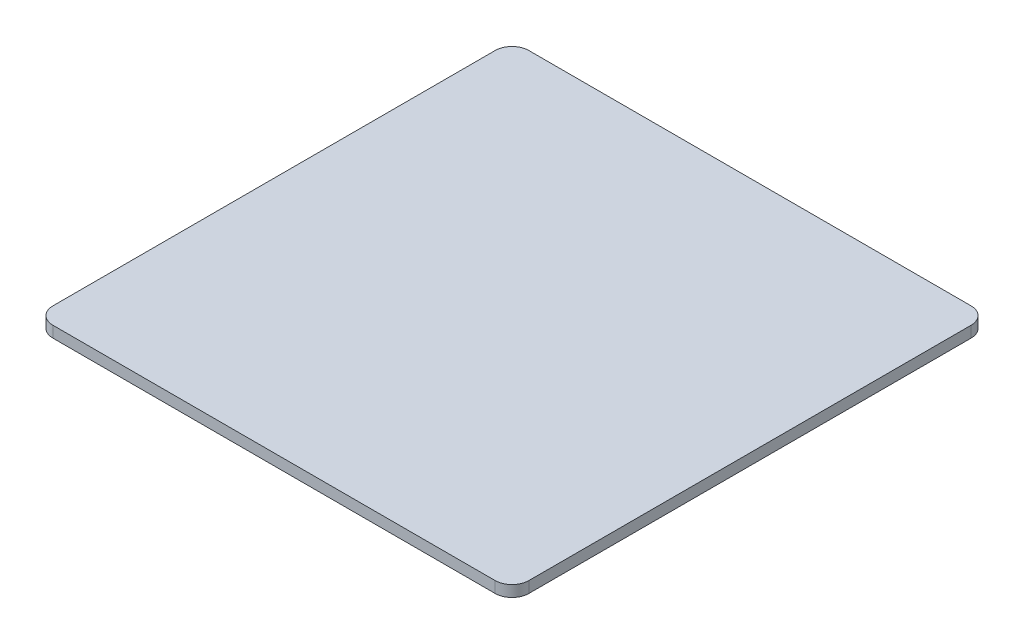
ISO-10303-21;
HEADER;
FILE_DESCRIPTION(('STEP AP214'),'2;1');
FILE_NAME('part.step','',(''),(''),'','','');
FILE_SCHEMA(('AUTOMOTIVE_DESIGN { 1 0 10303 214 1 1 1 1 }'));
ENDSEC;
DATA;
#1=APPLICATION_CONTEXT('core data for automotive mechanical design processes');
#2=APPLICATION_PROTOCOL_DEFINITION('international standard','automotive_design',2000,#1);
#3=PRODUCT_CONTEXT('',#1,'mechanical');
#4=PRODUCT('Part','Part','',(#3));
#5=PRODUCT_RELATED_PRODUCT_CATEGORY('part','',(#4));
#6=PRODUCT_DEFINITION_FORMATION('','',#4);
#7=PRODUCT_DEFINITION_CONTEXT('part definition',#1,'design');
#8=PRODUCT_DEFINITION('design','',#6,#7);
#9=PRODUCT_DEFINITION_SHAPE('','',#8);
#10=(LENGTH_UNIT() NAMED_UNIT(*) SI_UNIT(.MILLI.,.METRE.));
#11=(NAMED_UNIT(*) PLANE_ANGLE_UNIT() SI_UNIT($,.RADIAN.));
#12=(NAMED_UNIT(*) SI_UNIT($,.STERADIAN.) SOLID_ANGLE_UNIT());
#13=UNCERTAINTY_MEASURE_WITH_UNIT(LENGTH_MEASURE(1.E-05),#10,'distance_accuracy_value','');
#14=(GEOMETRIC_REPRESENTATION_CONTEXT(3) GLOBAL_UNCERTAINTY_ASSIGNED_CONTEXT((#13)) GLOBAL_UNIT_ASSIGNED_CONTEXT((#10,
#11,#12)) REPRESENTATION_CONTEXT('',''));
#15=CARTESIAN_POINT('',(0.,0.,0.));
#16=DIRECTION('',(0.,0.,1.));
#17=DIRECTION('',(1.,0.,0.));
#18=AXIS2_PLACEMENT_3D('',#15,#16,#17);
#19=CARTESIAN_POINT('',(42.5,2.,42.5));
#20=DIRECTION('',(-1.,0.,0.));
#21=DIRECTION('',(0.,0.,1.));
#22=AXIS2_PLACEMENT_3D('',#19,#20,#21);
#23=PLANE('',#22);
#24=DIRECTION('',(0.,0.,-1.));
#25=VECTOR('',#24,1.);
#26=CARTESIAN_POINT('',(42.5,0.,42.5));
#27=LINE('',#26,#25);
#28=CARTESIAN_POINT('',(42.5,0.,39.5));
#29=VERTEX_POINT('',#28);
#30=CARTESIAN_POINT('',(42.5,0.,-39.5));
#31=VERTEX_POINT('',#30);
#32=EDGE_CURVE('E128',#29,#31,#27,.T.);
#33=ORIENTED_EDGE('',*,*,#32,.T.);
#34=DIRECTION('',(0.,-1.,0.));
#35=VECTOR('',#34,1.);
#36=CARTESIAN_POINT('',(42.5,2.,-39.5));
#37=LINE('',#36,#35);
#38=CARTESIAN_POINT('',(42.5,2.,-39.5));
#39=VERTEX_POINT('',#38);
#40=EDGE_CURVE('E151',#31,#39,#37,.F.);
#41=ORIENTED_EDGE('',*,*,#40,.T.);
#42=DIRECTION('',(0.,0.,-1.));
#43=VECTOR('',#42,1.);
#44=CARTESIAN_POINT('',(42.5,2.,42.5));
#45=LINE('',#44,#43);
#46=CARTESIAN_POINT('',(42.5,2.,39.5));
#47=VERTEX_POINT('',#46);
#48=EDGE_CURVE('E126',#47,#39,#45,.T.);
#49=ORIENTED_EDGE('',*,*,#48,.F.);
#50=DIRECTION('',(0.,-1.,0.));
#51=VECTOR('',#50,1.);
#52=CARTESIAN_POINT('',(42.5,2.,39.5));
#53=LINE('',#52,#51);
#54=EDGE_CURVE('E148',#47,#29,#53,.T.);
#55=ORIENTED_EDGE('',*,*,#54,.T.);
#56=EDGE_LOOP('',(#33,#41,#49,#55));
#57=FACE_BOUND('',#56,.T.);
#58=ADVANCED_FACE('F33',(#57),#23,.F.);
#59=CARTESIAN_POINT('',(-42.5,2.,-42.5));
#60=DIRECTION('',(0.,0.,1.));
#61=DIRECTION('',(1.,0.,0.));
#62=AXIS2_PLACEMENT_3D('',#59,#60,#61);
#63=PLANE('',#62);
#64=DIRECTION('',(-1.,0.,0.));
#65=VECTOR('',#64,1.);
#66=CARTESIAN_POINT('',(-42.5,0.,-42.5));
#67=LINE('',#66,#65);
#68=CARTESIAN_POINT('',(39.5,0.,-42.5));
#69=VERTEX_POINT('',#68);
#70=CARTESIAN_POINT('',(-39.5,0.,-42.5));
#71=VERTEX_POINT('',#70);
#72=EDGE_CURVE('E124',#69,#71,#67,.T.);
#73=ORIENTED_EDGE('',*,*,#72,.T.);
#74=DIRECTION('',(0.,-1.,0.));
#75=VECTOR('',#74,1.);
#76=CARTESIAN_POINT('',(-39.5,2.,-42.5));
#77=LINE('',#76,#75);
#78=CARTESIAN_POINT('',(-39.5,2.,-42.5));
#79=VERTEX_POINT('',#78);
#80=EDGE_CURVE('E103',#71,#79,#77,.F.);
#81=ORIENTED_EDGE('',*,*,#80,.T.);
#82=DIRECTION('',(-1.,0.,0.));
#83=VECTOR('',#82,1.);
#84=CARTESIAN_POINT('',(-42.5,2.,-42.5));
#85=LINE('',#84,#83);
#86=CARTESIAN_POINT('',(39.5,2.,-42.5));
#87=VERTEX_POINT('',#86);
#88=EDGE_CURVE('E167',#87,#79,#85,.T.);
#89=ORIENTED_EDGE('',*,*,#88,.F.);
#90=DIRECTION('',(0.,-1.,0.));
#91=VECTOR('',#90,1.);
#92=CARTESIAN_POINT('',(39.5,2.,-42.5));
#93=LINE('',#92,#91);
#94=EDGE_CURVE('E108',#87,#69,#93,.T.);
#95=ORIENTED_EDGE('',*,*,#94,.T.);
#96=EDGE_LOOP('',(#73,#81,#89,#95));
#97=FACE_BOUND('',#96,.T.);
#98=ADVANCED_FACE('F184',(#97),#63,.F.);
#99=CARTESIAN_POINT('',(-42.5,2.,42.5));
#100=DIRECTION('',(1.,0.,0.));
#101=DIRECTION('',(0.,0.,-1.));
#102=AXIS2_PLACEMENT_3D('',#99,#100,#101);
#103=PLANE('',#102);
#104=DIRECTION('',(0.,0.,1.));
#105=VECTOR('',#104,1.);
#106=CARTESIAN_POINT('',(-42.5,2.,42.5));
#107=LINE('',#106,#105);
#108=CARTESIAN_POINT('',(-42.5,2.,-39.5));
#109=VERTEX_POINT('',#108);
#110=CARTESIAN_POINT('',(-42.5,2.,39.5));
#111=VERTEX_POINT('',#110);
#112=EDGE_CURVE('E117',#109,#111,#107,.T.);
#113=ORIENTED_EDGE('',*,*,#112,.F.);
#114=DIRECTION('',(0.,-1.,0.));
#115=VECTOR('',#114,1.);
#116=CARTESIAN_POINT('',(-42.5,2.,-39.5));
#117=LINE('',#116,#115);
#118=CARTESIAN_POINT('',(-42.5,0.,-39.5));
#119=VERTEX_POINT('',#118);
#120=EDGE_CURVE('E102',#109,#119,#117,.T.);
#121=ORIENTED_EDGE('',*,*,#120,.T.);
#122=DIRECTION('',(0.,0.,1.));
#123=VECTOR('',#122,1.);
#124=CARTESIAN_POINT('',(-42.5,0.,42.5));
#125=LINE('',#124,#123);
#126=CARTESIAN_POINT('',(-42.5,0.,39.5));
#127=VERTEX_POINT('',#126);
#128=EDGE_CURVE('E115',#119,#127,#125,.T.);
#129=ORIENTED_EDGE('',*,*,#128,.T.);
#130=DIRECTION('',(0.,-1.,0.));
#131=VECTOR('',#130,1.);
#132=CARTESIAN_POINT('',(-42.5,2.,39.5));
#133=LINE('',#132,#131);
#134=EDGE_CURVE('E119',#127,#111,#133,.F.);
#135=ORIENTED_EDGE('',*,*,#134,.T.);
#136=EDGE_LOOP('',(#113,#121,#129,#135));
#137=FACE_BOUND('',#136,.T.);
#138=ADVANCED_FACE('F114',(#137),#103,.F.);
#139=CARTESIAN_POINT('',(-42.5,2.,42.5));
#140=DIRECTION('',(0.,0.,-1.));
#141=DIRECTION('',(-1.,0.,0.));
#142=AXIS2_PLACEMENT_3D('',#139,#140,#141);
#143=PLANE('',#142);
#144=DIRECTION('',(1.,0.,0.));
#145=VECTOR('',#144,1.);
#146=CARTESIAN_POINT('',(-42.5,0.,42.5));
#147=LINE('',#146,#145);
#148=CARTESIAN_POINT('',(-39.5,0.,42.5));
#149=VERTEX_POINT('',#148);
#150=CARTESIAN_POINT('',(39.5,0.,42.5));
#151=VERTEX_POINT('',#150);
#152=EDGE_CURVE('E123',#149,#151,#147,.T.);
#153=ORIENTED_EDGE('',*,*,#152,.T.);
#154=DIRECTION('',(0.,-1.,0.));
#155=VECTOR('',#154,1.);
#156=CARTESIAN_POINT('',(39.5,2.,42.5));
#157=LINE('',#156,#155);
#158=CARTESIAN_POINT('',(39.5,2.,42.5));
#159=VERTEX_POINT('',#158);
#160=EDGE_CURVE('E11',#151,#159,#157,.F.);
#161=ORIENTED_EDGE('',*,*,#160,.T.);
#162=DIRECTION('',(1.,0.,0.));
#163=VECTOR('',#162,1.);
#164=CARTESIAN_POINT('',(-42.5,2.,42.5));
#165=LINE('',#164,#163);
#166=CARTESIAN_POINT('',(-39.5,2.,42.5));
#167=VERTEX_POINT('',#166);
#168=EDGE_CURVE('E132',#167,#159,#165,.T.);
#169=ORIENTED_EDGE('',*,*,#168,.F.);
#170=DIRECTION('',(0.,-1.,0.));
#171=VECTOR('',#170,1.);
#172=CARTESIAN_POINT('',(-39.5,2.,42.5));
#173=LINE('',#172,#171);
#174=EDGE_CURVE('E41',#167,#149,#173,.T.);
#175=ORIENTED_EDGE('',*,*,#174,.T.);
#176=EDGE_LOOP('',(#153,#161,#169,#175));
#177=FACE_BOUND('',#176,.T.);
#178=ADVANCED_FACE('F154',(#177),#143,.F.);
#179=CARTESIAN_POINT('',(0.,2.,0.));
#180=DIRECTION('',(0.,-1.,0.));
#181=DIRECTION('',(0.,0.,-1.));
#182=AXIS2_PLACEMENT_3D('',#179,#180,#181);
#183=PLANE('',#182);
#184=ORIENTED_EDGE('',*,*,#88,.T.);
#185=CARTESIAN_POINT('',(-39.5,2.,-39.5));
#186=DIRECTION('',(0.,-1.,0.));
#187=DIRECTION('',(0.,0.,-1.));
#188=AXIS2_PLACEMENT_3D('',#185,#186,#187);
#189=CIRCLE('',#188,3.);
#190=EDGE_CURVE('E146',#79,#109,#189,.F.);
#191=ORIENTED_EDGE('',*,*,#190,.T.);
#192=ORIENTED_EDGE('',*,*,#112,.T.);
#193=CARTESIAN_POINT('',(-39.5,2.,39.5));
#194=DIRECTION('',(0.,-1.,0.));
#195=DIRECTION('',(0.,0.,-1.));
#196=AXIS2_PLACEMENT_3D('',#193,#194,#195);
#197=CIRCLE('',#196,3.);
#198=EDGE_CURVE('E53',#111,#167,#197,.F.);
#199=ORIENTED_EDGE('',*,*,#198,.T.);
#200=ORIENTED_EDGE('',*,*,#168,.T.);
#201=CARTESIAN_POINT('',(39.5,2.,39.5));
#202=DIRECTION('',(0.,-1.,0.));
#203=DIRECTION('',(0.,0.,-1.));
#204=AXIS2_PLACEMENT_3D('',#201,#202,#203);
#205=CIRCLE('',#204,3.);
#206=EDGE_CURVE('E142',#159,#47,#205,.F.);
#207=ORIENTED_EDGE('',*,*,#206,.T.);
#208=ORIENTED_EDGE('',*,*,#48,.T.);
#209=CARTESIAN_POINT('',(39.5,2.,-39.5));
#210=DIRECTION('',(0.,-1.,0.));
#211=DIRECTION('',(0.,0.,-1.));
#212=AXIS2_PLACEMENT_3D('',#209,#210,#211);
#213=CIRCLE('',#212,3.);
#214=EDGE_CURVE('E144',#39,#87,#213,.F.);
#215=ORIENTED_EDGE('',*,*,#214,.T.);
#216=EDGE_LOOP('',(#184,#191,#192,#199,#200,#207,#208,#215));
#217=FACE_BOUND('',#216,.T.);
#218=ADVANCED_FACE('F173',(#217),#183,.F.);
#219=CARTESIAN_POINT('',(0.,0.,0.));
#220=DIRECTION('',(0.,-1.,0.));
#221=DIRECTION('',(0.,0.,-1.));
#222=AXIS2_PLACEMENT_3D('',#219,#220,#221);
#223=PLANE('',#222);
#224=ORIENTED_EDGE('',*,*,#128,.F.);
#225=CARTESIAN_POINT('',(-39.5,0.,-39.5));
#226=DIRECTION('',(0.,-1.,0.));
#227=DIRECTION('',(0.,0.,-1.));
#228=AXIS2_PLACEMENT_3D('',#225,#226,#227);
#229=CIRCLE('',#228,3.);
#230=EDGE_CURVE('E98',#119,#71,#229,.T.);
#231=ORIENTED_EDGE('',*,*,#230,.T.);
#232=ORIENTED_EDGE('',*,*,#72,.F.);
#233=CARTESIAN_POINT('',(39.5,0.,-39.5));
#234=DIRECTION('',(0.,-1.,0.));
#235=DIRECTION('',(0.,0.,-1.));
#236=AXIS2_PLACEMENT_3D('',#233,#234,#235);
#237=CIRCLE('',#236,3.);
#238=EDGE_CURVE('E109',#69,#31,#237,.T.);
#239=ORIENTED_EDGE('',*,*,#238,.T.);
#240=ORIENTED_EDGE('',*,*,#32,.F.);
#241=CARTESIAN_POINT('',(39.5,0.,39.5));
#242=DIRECTION('',(0.,-1.,0.));
#243=DIRECTION('',(0.,0.,-1.));
#244=AXIS2_PLACEMENT_3D('',#241,#242,#243);
#245=CIRCLE('',#244,3.);
#246=EDGE_CURVE('E135',#29,#151,#245,.T.);
#247=ORIENTED_EDGE('',*,*,#246,.T.);
#248=ORIENTED_EDGE('',*,*,#152,.F.);
#249=CARTESIAN_POINT('',(-39.5,0.,39.5));
#250=DIRECTION('',(0.,-1.,0.));
#251=DIRECTION('',(0.,0.,-1.));
#252=AXIS2_PLACEMENT_3D('',#249,#250,#251);
#253=CIRCLE('',#252,3.);
#254=EDGE_CURVE('E118',#149,#127,#253,.T.);
#255=ORIENTED_EDGE('',*,*,#254,.T.);
#256=EDGE_LOOP('',(#224,#231,#232,#239,#240,#247,#248,#255));
#257=FACE_BOUND('',#256,.T.);
#258=ADVANCED_FACE('F121',(#257),#223,.T.);
#259=CARTESIAN_POINT('',(-39.5,2.,-39.5));
#260=DIRECTION('',(0.,-1.,0.));
#261=DIRECTION('',(0.,0.,-1.));
#262=AXIS2_PLACEMENT_3D('',#259,#260,#261);
#263=CYLINDRICAL_SURFACE('',#262,3.);
#264=ORIENTED_EDGE('',*,*,#190,.F.);
#265=ORIENTED_EDGE('',*,*,#80,.F.);
#266=ORIENTED_EDGE('',*,*,#230,.F.);
#267=ORIENTED_EDGE('',*,*,#120,.F.);
#268=EDGE_LOOP('',(#264,#265,#266,#267));
#269=FACE_BOUND('',#268,.T.);
#270=ADVANCED_FACE('F101',(#269),#263,.T.);
#271=CARTESIAN_POINT('',(39.5,2.,-39.5));
#272=DIRECTION('',(0.,-1.,0.));
#273=DIRECTION('',(0.,0.,-1.));
#274=AXIS2_PLACEMENT_3D('',#271,#272,#273);
#275=CYLINDRICAL_SURFACE('',#274,3.);
#276=ORIENTED_EDGE('',*,*,#214,.F.);
#277=ORIENTED_EDGE('',*,*,#40,.F.);
#278=ORIENTED_EDGE('',*,*,#238,.F.);
#279=ORIENTED_EDGE('',*,*,#94,.F.);
#280=EDGE_LOOP('',(#276,#277,#278,#279));
#281=FACE_BOUND('',#280,.T.);
#282=ADVANCED_FACE('F195',(#281),#275,.T.);
#283=CARTESIAN_POINT('',(39.5,2.,39.5));
#284=DIRECTION('',(0.,-1.,0.));
#285=DIRECTION('',(0.,0.,-1.));
#286=AXIS2_PLACEMENT_3D('',#283,#284,#285);
#287=CYLINDRICAL_SURFACE('',#286,3.);
#288=ORIENTED_EDGE('',*,*,#206,.F.);
#289=ORIENTED_EDGE('',*,*,#160,.F.);
#290=ORIENTED_EDGE('',*,*,#246,.F.);
#291=ORIENTED_EDGE('',*,*,#54,.F.);
#292=EDGE_LOOP('',(#288,#289,#290,#291));
#293=FACE_BOUND('',#292,.T.);
#294=ADVANCED_FACE('F161',(#293),#287,.T.);
#295=CARTESIAN_POINT('',(-39.5,2.,39.5));
#296=DIRECTION('',(0.,-1.,0.));
#297=DIRECTION('',(0.,0.,-1.));
#298=AXIS2_PLACEMENT_3D('',#295,#296,#297);
#299=CYLINDRICAL_SURFACE('',#298,3.);
#300=ORIENTED_EDGE('',*,*,#198,.F.);
#301=ORIENTED_EDGE('',*,*,#134,.F.);
#302=ORIENTED_EDGE('',*,*,#254,.F.);
#303=ORIENTED_EDGE('',*,*,#174,.F.);
#304=EDGE_LOOP('',(#300,#301,#302,#303));
#305=FACE_BOUND('',#304,.T.);
#306=ADVANCED_FACE('F35',(#305),#299,.T.);
#307=CLOSED_SHELL('',(#58,#98,#138,#178,#218,#258,#270,#282,#294,#306));
#308=MANIFOLD_SOLID_BREP('B2',#307);
#309=ADVANCED_BREP_SHAPE_REPRESENTATION('',(#18,#308),#14);
#310=SHAPE_DEFINITION_REPRESENTATION(#9,#309);
ENDSEC;
END-ISO-10303-21;
